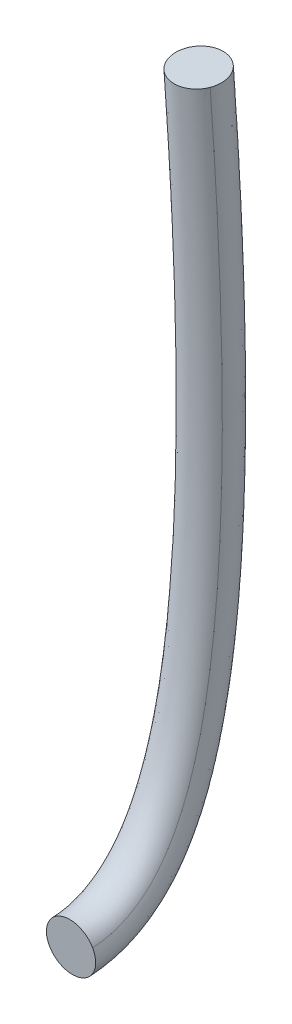
ISO-10303-21;
HEADER;
FILE_DESCRIPTION(('STEP AP214'),'2;1');
FILE_NAME('part.step','',(''),(''),'','','');
FILE_SCHEMA(('AUTOMOTIVE_DESIGN { 1 0 10303 214 1 1 1 1 }'));
ENDSEC;
DATA;
#1=APPLICATION_CONTEXT('core data for automotive mechanical design processes');
#2=APPLICATION_PROTOCOL_DEFINITION('international standard','automotive_design',2000,#1);
#3=PRODUCT_CONTEXT('',#1,'mechanical');
#4=PRODUCT('Part','Part','',(#3));
#5=PRODUCT_RELATED_PRODUCT_CATEGORY('part','',(#4));
#6=PRODUCT_DEFINITION_FORMATION('','',#4);
#7=PRODUCT_DEFINITION_CONTEXT('part definition',#1,'design');
#8=PRODUCT_DEFINITION('design','',#6,#7);
#9=PRODUCT_DEFINITION_SHAPE('','',#8);
#10=(LENGTH_UNIT() NAMED_UNIT(*) SI_UNIT(.MILLI.,.METRE.));
#11=(NAMED_UNIT(*) PLANE_ANGLE_UNIT() SI_UNIT($,.RADIAN.));
#12=(NAMED_UNIT(*) SI_UNIT($,.STERADIAN.) SOLID_ANGLE_UNIT());
#13=UNCERTAINTY_MEASURE_WITH_UNIT(LENGTH_MEASURE(1.E-05),#10,'distance_accuracy_value','');
#14=(GEOMETRIC_REPRESENTATION_CONTEXT(3) GLOBAL_UNCERTAINTY_ASSIGNED_CONTEXT((#13)) GLOBAL_UNIT_ASSIGNED_CONTEXT((#10,
#11,#12)) REPRESENTATION_CONTEXT('',''));
#15=CARTESIAN_POINT('',(0.,0.,0.));
#16=DIRECTION('',(0.,0.,1.));
#17=DIRECTION('',(1.,0.,0.));
#18=AXIS2_PLACEMENT_3D('',#15,#16,#17);
#19=CARTESIAN_POINT('',(17.9828948609528,-7.28816581524924,11.1726701010151));
#20=CARTESIAN_POINT('',(17.9828948609529,-7.27979984538482,11.0210211909464));
#21=CARTESIAN_POINT('',(17.9828948609531,-7.19251932348195,10.7546346271501));
#22=CARTESIAN_POINT('',(17.982894860953,-6.82521696261271,10.4241670798163));
#23=CARTESIAN_POINT('',(17.9828948609526,-6.16593331407854,10.1770697024865));
#24=CARTESIAN_POINT('',(17.9828948609521,-5.06042478911119,10.0061113265432));
#25=CARTESIAN_POINT('',(17.9828948609519,-3.38309790841542,9.96220340685519));
#26=CARTESIAN_POINT('',(17.9828948609523,-1.84086867718057,10.0365190113268));
#27=CARTESIAN_POINT('',(17.9828948609527,-1.0071145733577,10.0974125910793));
#28=CARTESIAN_POINT('',(17.9537952925283,-7.22780287596828,11.1760001251526));
#29=CARTESIAN_POINT('',(17.9537952925284,-7.21999009473669,11.0343787976106));
#30=CARTESIAN_POINT('',(17.9537952925286,-7.14065988628679,10.7916644286922));
#31=CARTESIAN_POINT('',(17.9537952925285,-6.79719097052566,10.4792288227987));
#32=CARTESIAN_POINT('',(17.9537952925281,-6.15275477480742,10.2363735809446));
#33=CARTESIAN_POINT('',(17.9537952925276,-5.05673173542727,10.0666883604314));
#34=CARTESIAN_POINT('',(17.9537952925274,-3.38440018237537,10.0226626634998));
#35=CARTESIAN_POINT('',(17.9537952925278,-1.84433188417572,10.0968818207855));
#36=CARTESIAN_POINT('',(17.9537952925282,-1.01151818014321,10.157706718046));
#37=CARTESIAN_POINT('',(17.8372931422432,-7.13476731687341,11.1811325898919));
#38=CARTESIAN_POINT('',(17.8372931422434,-7.12780674764234,11.0549592048029));
#39=CARTESIAN_POINT('',(17.8372931422436,-7.06073585925256,10.8487282128721));
#40=CARTESIAN_POINT('',(17.8372931422435,-6.75399018511548,10.5640769234541));
#41=CARTESIAN_POINT('',(17.8372931422431,-6.13243652817361,10.327766226239));
#42=CARTESIAN_POINT('',(17.8372931422426,-5.05103406644591,10.1600468345949));
#43=CARTESIAN_POINT('',(17.8372931422424,-3.3864021048026,10.1158428459373));
#44=CARTESIAN_POINT('',(17.8372931422428,-1.84967030091329,10.1899171300291));
#45=CARTESIAN_POINT('',(17.8372931422433,-1.01830532510668,10.2506362188175));
#46=CARTESIAN_POINT('',(17.6193944079575,-7.18477640782297,11.1783737533946));
#47=CARTESIAN_POINT('',(17.6193944079577,-7.17735849766137,11.0439102053286));
#48=CARTESIAN_POINT('',(17.6193944079579,-7.10368721033171,10.8180718793657));
#49=CARTESIAN_POINT('',(17.6193944079577,-6.77722139184719,10.5185002285866));
#50=CARTESIAN_POINT('',(17.6193944079574,-6.14337034316558,10.2786599971527));
#51=CARTESIAN_POINT('',(17.6193944079569,-5.05410727978171,10.1098773088842));
#52=CARTESIAN_POINT('',(17.6193944079566,-3.3853357544798,10.0657631380452));
#53=CARTESIAN_POINT('',(17.619394407957,-1.84679949203958,10.1399082659676));
#54=CARTESIAN_POINT('',(17.6193944079575,-1.01465705391788,10.2006841370415));
#55=CARTESIAN_POINT('',(17.5550000000014,-7.31847179552639,11.1709982201049));
#56=CARTESIAN_POINT('',(17.5550000000015,-7.30982729388697,11.0143003987002));
#57=CARTESIAN_POINT('',(17.5550000000017,-7.21856663037596,10.7360252213707));
#58=CARTESIAN_POINT('',(17.5550000000016,-6.83927747920377,10.396489078144));
#59=CARTESIAN_POINT('',(17.5550000000013,-6.1725367206153,10.1472743428811));
#60=CARTESIAN_POINT('',(17.5550000000008,-5.06226765115461,9.97568382362931));
#61=CARTESIAN_POINT('',(17.5550000000005,-3.38243368726151,9.93184146326353));
#62=CARTESIAN_POINT('',(17.5550000000009,-1.83913128396928,10.00621299735));
#63=CARTESIAN_POINT('',(17.5550000000014,-1.00490368664486,10.0671411588984));
#64=CARTESIAN_POINT('',(17.555,-7.38568943191456,11.1672900449514));
#65=CARTESIAN_POINT('',(17.5550000000002,-7.37642950308164,10.9994364502612));
#66=CARTESIAN_POINT('',(17.5550000000004,-7.27630738479391,10.6948035976056));
#67=CARTESIAN_POINT('',(17.5550000000003,-6.87049354697238,10.3351990877175));
#68=CARTESIAN_POINT('',(17.5549999999999,-6.18722129795571,10.0812514068247));
#69=CARTESIAN_POINT('',(17.5549999999994,-5.06638830404402,9.90823800900155));
#70=CARTESIAN_POINT('',(17.5549999999991,-3.38099110822586,9.86452211553343));
#71=CARTESIAN_POINT('',(17.5549999999996,-1.83527381521949,9.93899557759439));
#72=CARTESIAN_POINT('',(17.555,-1.00000001490137,10.0000001490162));
#73=B_SPLINE_SURFACE_WITH_KNOTS('',3,3,((#19,#20,#21,#22,#23,#24,#25,#26,#27),(#28,#29,#30,#31,
#32,#33,#34,#35,#36),(#37,#38,#39,#40,#41,#42,#43,#44,#45),(#46,#47,#48,#49,#50,#51,#52,#53,
#54),(#55,#56,#57,#58,#59,#60,#61,#62,#63),(#64,#65,#66,#67,#68,#69,#70,#71,#72)),.UNSPECIFIED.,
.F.,.F.,.F.,(4,1,1,4),(4,1,1,1,1,1,4),(0.448798950512828,1.34639685153848,2.24399475256414,
3.14159265358979),(0.,0.142857142857143,0.285714285714286,0.428571428571429,0.571428571428571,
0.785714285714286,1.),.UNSPECIFIED.);
#74=CARTESIAN_POINT('',(17.555,-7.38568943191456,11.1672900449514));
#75=CARTESIAN_POINT('',(17.5550000000002,-7.37642950308164,10.9994364502612));
#76=CARTESIAN_POINT('',(17.5550000000004,-7.27630738479391,10.6948035976056));
#77=CARTESIAN_POINT('',(17.5550000000003,-6.87049354697238,10.3351990877175));
#78=CARTESIAN_POINT('',(17.5549999999999,-6.18722129795571,10.0812514068247));
#79=CARTESIAN_POINT('',(17.5549999999994,-5.06638830404402,9.90823800900155));
#80=CARTESIAN_POINT('',(17.5549999999991,-3.38099110822586,9.86452211553343));
#81=CARTESIAN_POINT('',(17.5549999999996,-1.83527381521949,9.93899557759439));
#82=CARTESIAN_POINT('',(17.555,-1.00000001490137,10.0000001490162));
#83=B_SPLINE_CURVE_WITH_KNOTS('',3,(#74,#75,#76,#77,#78,#79,#80,#81,#82),.UNSPECIFIED.,.F.,.F.,
(4,1,1,1,1,1,4),(0.,0.142857142857143,0.285714285714286,0.428571428571429,0.571428571428571,
0.785714285714286,1.),.UNSPECIFIED.);
#84=CARTESIAN_POINT('',(17.555,-7.38568943191456,11.1672900449514));
#85=VERTEX_POINT('',#84);
#86=CARTESIAN_POINT('',(17.555,-1.00000001490137,10.0000001490162));
#87=VERTEX_POINT('',#86);
#88=EDGE_CURVE('E11',#85,#87,#83,.T.);
#89=CARTESIAN_POINT('',(17.555,-7.38568943191456,11.1672900449514));
#90=CARTESIAN_POINT('',(17.5549787274771,-7.41102471275125,11.1658923811245));
#91=CARTESIAN_POINT('',(17.5594742792876,-7.43643253137826,11.1644907156272));
#92=CARTESIAN_POINT('',(17.5764203979954,-7.48437601313137,11.1618458319721));
#93=CARTESIAN_POINT('',(17.5888657028604,-7.50691356429396,11.1606025096577));
#94=CARTESIAN_POINT('',(17.62068241915,-7.54639939321399,11.1584242067958));
#95=CARTESIAN_POINT('',(17.6400432100441,-7.56335616540561,11.1574887576383));
#96=CARTESIAN_POINT('',(17.6830889643929,-7.58996281842432,11.1560209564043));
#97=CARTESIAN_POINT('',(17.7067443116465,-7.59966054680912,11.1554859647358));
#98=CARTESIAN_POINT('',(17.7560076016807,-7.61052235072792,11.1548867548621));
#99=CARTESIAN_POINT('',(17.7816204807639,-7.61166408187141,11.1548237693232));
#100=CARTESIAN_POINT('',(17.8318892542795,-7.60564134921908,11.1551560236062));
#101=CARTESIAN_POINT('',(17.8565434788333,-7.59846300864074,11.1555520289644));
#102=CARTESIAN_POINT('',(17.9020065070542,-7.57620555302376,11.1567798993321));
#103=CARTESIAN_POINT('',(17.9228097887315,-7.5611152096526,11.1576123837715));
#104=CARTESIAN_POINT('',(17.9585076077076,-7.52495357970438,11.1596073015475));
#105=CARTESIAN_POINT('',(17.9733789898422,-7.5038593953419,11.1607709980792));
#106=CARTESIAN_POINT('',(17.9945562726862,-7.45822998378214,11.1632882221191));
#107=CARTESIAN_POINT('',(18.0010306892592,-7.43377371561458,11.1646373937181));
#108=CARTESIAN_POINT('',(18.0047933580637,-7.39652794522938,11.1666921199439));
#109=CARTESIAN_POINT('',(18.0050376426428,-7.38393459611462,11.1673868534513));
#110=CARTESIAN_POINT('',(18.0035025302005,-7.35885995780878,11.16877013849));
#111=CARTESIAN_POINT('',(18.0017241531995,-7.34637861533122,11.1694586929609));
#112=CARTESIAN_POINT('',(17.9960058832831,-7.32135945624951,11.1708389173938));
#113=CARTESIAN_POINT('',(17.9919782108732,-7.30884135038829,11.1715294999793));
#114=CARTESIAN_POINT('',(17.981666296378,-7.28477231923517,11.1728573089902));
#115=CARTESIAN_POINT('',(17.9753834815006,-7.27322078791776,11.1734945688482));
#116=CARTESIAN_POINT('',(17.9613882215489,-7.25221068569534,11.1746536268458));
#117=CARTESIAN_POINT('',(17.9538105464108,-7.24266144101503,11.1751804271583));
#118=CARTESIAN_POINT('',(17.9372451544926,-7.22485205074891,11.176162912441));
#119=CARTESIAN_POINT('',(17.9282555430136,-7.2165936675374,11.1766185001866));
#120=CARTESIAN_POINT('',(17.9085042664574,-7.20109346442636,11.1774735952352));
#121=CARTESIAN_POINT('',(17.8976669355207,-7.19394752816238,11.1778678129543));
#122=CARTESIAN_POINT('',(17.8749582710206,-7.1815732741487,11.1785504597081));
#123=CARTESIAN_POINT('',(17.8630884396757,-7.17634222626356,11.1788390393552));
#124=CARTESIAN_POINT('',(17.8386530200918,-7.16811186531233,11.1792930812053));
#125=CARTESIAN_POINT('',(17.826091117051,-7.16510176652687,11.1794591384208));
#126=CARTESIAN_POINT('',(17.8006273173911,-7.16139489732678,11.1796636341603));
#127=CARTESIAN_POINT('',(17.7877252116967,-7.16069958454094,11.1797019922718));
#128=CARTESIAN_POINT('',(17.7627092575344,-7.1614527433657,11.1796604429852));
#129=CARTESIAN_POINT('',(17.750591327366,-7.16278461841239,11.1795869678346));
#130=CARTESIAN_POINT('',(17.7267024472358,-7.16730519940402,11.179337582301));
#131=CARTESIAN_POINT('',(17.714931678428,-7.1704948573672,11.1791616193983));
#132=CARTESIAN_POINT('',(17.6911222318988,-7.17899075575905,11.178692928724));
#133=CARTESIAN_POINT('',(17.6791354553194,-7.18444389803625,11.1783920968622));
#134=CARTESIAN_POINT('',(17.6563290996798,-7.19736744633008,11.1776791473559));
#135=CARTESIAN_POINT('',(17.6455078855712,-7.20483497361077,11.1772671885217));
#136=CARTESIAN_POINT('',(17.616456190345,-7.22919786630976,11.175923168139));
#137=CARTESIAN_POINT('',(17.6002418441554,-7.24855625463276,11.1748552297459));
#138=CARTESIAN_POINT('',(17.5746441856777,-7.29145024800524,11.1724889096994));
#139=CARTESIAN_POINT('',(17.565304015267,-7.31501110069236,11.1711891352172));
#140=CARTESIAN_POINT('',(17.5567288082222,-7.35460631274689,11.1690047980487));
#141=CARTESIAN_POINT('',(17.5550130607995,-7.37013420021109,11.1681481757458));
#142=CARTESIAN_POINT('',(17.555,-7.38568943191456,11.1672900449514));
#143=B_SPLINE_CURVE_WITH_KNOTS('',3,(#89,#90,#91,#92,#93,#94,#95,#96,#97,#98,#99,#100,#101,#102,
#103,#104,#105,#106,#107,#108,#109,#110,#111,#112,#113,#114,#115,#116,#117,#118,#119,#120,#121,
#122,#123,#124,#125,#126,#127,#128,#129,#130,#131,#132,#133,#134,#135,#136,#137,#138,#139,#140,
#141,#142),.UNSPECIFIED.,.T.,.F.,(4,2,2,2,2,2,2,2,2,2,2,2,2,2,2,2,2,2,2,2,2,2,2,2,2,2,4),(0.,
0.0759486066991358,0.151846994167119,0.227629317542076,0.3029076178249,0.378382442656016,
0.453983330905396,0.529691799852834,0.605692970633179,0.680144014351651,0.717867994614963,
0.755572959255383,0.794864022626057,0.834130263649917,0.870581684838747,0.907082445377711,
0.945866090842247,0.984594223488994,1.02313301781127,1.06169607556072,1.09812339418812,
1.13456939638827,1.17388556286445,1.2131458379946,1.28747622307096,1.36226921307139,
1.40889976681879),.UNSPECIFIED.);
#144=CARTESIAN_POINT('',(17.9828948609528,-7.28816581524924,11.1726701010151));
#145=VERTEX_POINT('',#144);
#146=EDGE_CURVE('E45',#145,#85,#143,.T.);
#147=CARTESIAN_POINT('',(17.9828948609528,-7.28816581524924,11.1726701010151));
#148=CARTESIAN_POINT('',(17.9828948609529,-7.27979984538482,11.0210211909464));
#149=CARTESIAN_POINT('',(17.9828948609531,-7.19251932348195,10.7546346271501));
#150=CARTESIAN_POINT('',(17.982894860953,-6.82521696261271,10.4241670798163));
#151=CARTESIAN_POINT('',(17.9828948609526,-6.16593331407854,10.1770697024865));
#152=CARTESIAN_POINT('',(17.9828948609521,-5.06042478911119,10.0061113265432));
#153=CARTESIAN_POINT('',(17.9828948609519,-3.38309790841542,9.96220340685519));
#154=CARTESIAN_POINT('',(17.9828948609523,-1.84086867718057,10.0365190113268));
#155=CARTESIAN_POINT('',(17.9828948609527,-1.0071145733577,10.0974125910793));
#156=B_SPLINE_CURVE_WITH_KNOTS('',3,(#147,#148,#149,#150,#151,#152,#153,#154,#155),
.UNSPECIFIED.,.F.,.F.,(4,1,1,1,1,1,4),(0.,0.142857142857143,0.285714285714286,0.428571428571429,
0.571428571428571,0.785714285714286,1.),.UNSPECIFIED.);
#157=CARTESIAN_POINT('',(17.9828948609527,-1.0071145733577,10.0974125910793));
#158=VERTEX_POINT('',#157);
#159=EDGE_CURVE('E29',#145,#158,#156,.T.);
#160=CARTESIAN_POINT('',(17.555,-1.00000001490137,10.0000001490162));
#161=CARTESIAN_POINT('',(17.5550109258887,-1.00092580970206,10.0126761194143));
#162=CARTESIAN_POINT('',(17.556153025859,-1.00185188551025,10.0253559373633));
#163=CARTESIAN_POINT('',(17.5605838617681,-1.00367793175485,10.0503581388496));
#164=CARTESIAN_POINT('',(17.5638776976219,-1.00457783485198,10.0626796003785));
#165=CARTESIAN_POINT('',(17.5724215761546,-1.00632384922809,10.08658600656));
#166=CARTESIAN_POINT('',(17.5776659177798,-1.00717010894382,10.0981729836068));
#167=CARTESIAN_POINT('',(17.5899672644214,-1.00878880821922,10.1203361930814));
#168=CARTESIAN_POINT('',(17.5970229824559,-1.00956129965875,10.1309131358476));
#169=CARTESIAN_POINT('',(17.6130475330382,-1.01103195886521,10.1510493826191));
#170=CARTESIAN_POINT('',(17.6220672831449,-1.01172721185437,10.1605687775253));
#171=CARTESIAN_POINT('',(17.6417147706393,-1.01298383289045,10.1777744164453));
#172=CARTESIAN_POINT('',(17.6523414284897,-1.01354529017526,10.1854618823034));
#173=CARTESIAN_POINT('',(17.6740020608389,-1.01448716523158,10.1983580233527));
#174=CARTESIAN_POINT('',(17.6849560468646,-1.0148774723909,10.2037021039135));
#175=CARTESIAN_POINT('',(17.7075797325245,-1.01552888253597,10.2126212031671));
#176=CARTESIAN_POINT('',(17.7192503909068,-1.01578980801122,10.2161937913883));
#177=CARTESIAN_POINT('',(17.7437367343103,-1.01618882320902,10.2216571022989));
#178=CARTESIAN_POINT('',(17.7565787359315,-1.01631839245544,10.2234311627395));
#179=CARTESIAN_POINT('',(17.7823669991049,-1.01641929348824,10.2248126983711));
#180=CARTESIAN_POINT('',(17.7953130877931,-1.01639084849847,10.2244232299402));
#181=CARTESIAN_POINT('',(17.8208883822237,-1.01616582126333,10.2213421599564));
#182=CARTESIAN_POINT('',(17.8335185520129,-1.01596983795987,10.2186587591084));
#183=CARTESIAN_POINT('',(17.8580869140907,-1.01541487196054,10.2110601718465));
#184=CARTESIAN_POINT('',(17.8700246885338,-1.01505579197012,10.2061436532771));
#185=CARTESIAN_POINT('',(17.8922673547765,-1.01422128741594,10.1947176277495));
#186=CARTESIAN_POINT('',(17.9026259968799,-1.01375337428598,10.1883109672455));
#187=CARTESIAN_POINT('',(17.9222313573681,-1.01270636685299,10.1739753550587));
#188=CARTESIAN_POINT('',(17.931477438799,-1.01212720934921,10.166045538032));
#189=CARTESIAN_POINT('',(17.949312424714,-1.0108203944598,10.1481526455233));
#190=CARTESIAN_POINT('',(17.9577894691079,-1.01008456079276,10.1380776205021));
#191=CARTESIAN_POINT('',(17.9728211066353,-1.00851723873657,10.116617867246));
#192=CARTESIAN_POINT('',(17.9793785168292,-1.00768589303325,10.1052350926635));
#193=CARTESIAN_POINT('',(17.9951268221104,-1.00516538945402,10.0707243903624));
#194=CARTESIAN_POINT('',(18.0014235725758,-1.00337431205483,10.0462009818535));
#195=CARTESIAN_POINT('',(18.0048744485045,-1.00065795556197,10.0090086640004));
#196=CARTESIAN_POINT('',(18.0050135929016,-0.99974367883645,9.99649039893813));
#197=CARTESIAN_POINT('',(18.0032930383759,-0.997924210617665,9.97157826369575));
#198=CARTESIAN_POINT('',(18.0014346483117,-0.997019013567097,9.95918431742512));
#199=CARTESIAN_POINT('',(17.9955671605391,-0.995200063989509,9.93427928341132));
#200=CARTESIAN_POINT('',(17.9914591451676,-0.994287985000621,9.92179110973056));
#201=CARTESIAN_POINT('',(17.9810064873988,-0.992534323158184,9.89777999453931));
#202=CARTESIAN_POINT('',(17.9746621518833,-0.991692730651637,9.88625692086011));
#203=CARTESIAN_POINT('',(17.9605118913823,-0.990157308789329,9.86523394464496));
#204=CARTESIAN_POINT('',(17.9528285978137,-0.989457416868279,9.85565103354374));
#205=CARTESIAN_POINT('',(17.9360265426204,-0.988155671749476,9.83782755626851));
#206=CARTESIAN_POINT('',(17.9269072291485,-0.987553856423181,9.82958750863001));
#207=CARTESIAN_POINT('',(17.907039707438,-0.986440068511396,9.81433753899439));
#208=CARTESIAN_POINT('',(17.8962379650897,-0.985933131516255,9.80739656423499));
#209=CARTESIAN_POINT('',(17.8735897841357,-0.985064188738059,9.7954990109914));
#210=CARTESIAN_POINT('',(17.8617437274281,-0.984702130240073,9.79054171073507));
#211=CARTESIAN_POINT('',(17.8376323125895,-0.984135807464393,9.78278762663918));
#212=CARTESIAN_POINT('',(17.8253803751681,-0.983928484835537,9.77994896789518));
#213=CARTESIAN_POINT('',(17.8005742525679,-0.983661570210727,9.77629437631593));
#214=CARTESIAN_POINT('',(17.788019968838,-0.983602027060598,9.77547911227708));
#215=CARTESIAN_POINT('',(17.7626182732445,-0.983634269388105,9.77592057380711));
#216=CARTESIAN_POINT('',(17.7497716396555,-0.98372999195386,9.77723120593544));
#217=CARTESIAN_POINT('',(17.7245133511483,-0.9840848535487,9.78208996628754));
#218=CARTESIAN_POINT('',(17.7121015744107,-0.984343946419142,9.78563746250777));
#219=CARTESIAN_POINT('',(17.6884354825133,-0.985002490988233,9.79465424620273));
#220=CARTESIAN_POINT('',(17.6771575704743,-0.985397482202726,9.80006246078628));
#221=CARTESIAN_POINT('',(17.6556309092793,-0.986315656751378,9.81263409479245));
#222=CARTESIAN_POINT('',(17.6453823510939,-0.986838863811056,9.81979783906457));
#223=CARTESIAN_POINT('',(17.6259595965394,-0.988016645646907,9.83592401267841));
#224=CARTESIAN_POINT('',(17.6168195695772,-0.988674237227378,9.84492774806543));
#225=CARTESIAN_POINT('',(17.6002613544678,-0.990094366176443,9.86437213520871));
#226=CARTESIAN_POINT('',(17.5928430793332,-0.990856898240072,9.87481271432948));
#227=CARTESIAN_POINT('',(17.5737488902606,-0.993226390913928,9.90725577727381));
#228=CARTESIAN_POINT('',(17.56466578781,-0.994950891051668,9.93086761078286));
#229=CARTESIAN_POINT('',(17.5565627372199,-0.997806130586163,9.96996151344));
#230=CARTESIAN_POINT('',(17.5549870519646,-0.998902875418757,9.98497812945669));
#231=CARTESIAN_POINT('',(17.555,-1.00000001490137,10.0000001490162));
#232=B_SPLINE_CURVE_WITH_KNOTS('',3,(#160,#161,#162,#163,#164,#165,#166,#167,#168,#169,#170,
#171,#172,#173,#174,#175,#176,#177,#178,#179,#180,#181,#182,#183,#184,#185,#186,#187,#188,#189,
#190,#191,#192,#193,#194,#195,#196,#197,#198,#199,#200,#201,#202,#203,#204,#205,#206,#207,#208,
#209,#210,#211,#212,#213,#214,#215,#216,#217,#218,#219,#220,#221,#222,#223,#224,#225,#226,#227,
#228,#229,#230,#231),.UNSPECIFIED.,.T.,.F.,(4,2,2,2,2,2,2,2,2,2,2,2,2,2,2,2,2,2,2,2,2,2,2,2,2,2,
2,2,2,2,2,2,2,2,2,4),(0.,0.0380918255708393,0.0762742632660008,0.114345965073643,
0.152390691461817,0.191573550114243,0.23073020131476,0.267158188720046,0.303636017659139,
0.342352332765455,0.381013967954733,0.419537964786892,0.458084973167201,0.494505402028649,
0.530946583789762,0.570304953116594,0.609605271178396,0.684072743104415,0.721620326586792,
0.759143322491407,0.79846676445989,0.837784812317698,0.874533043301793,0.911295430857229,
0.949654046008332,0.987998691423081,1.02556378037021,1.06314128412303,1.10168662645717,
1.14022108306782,1.17759541961075,1.21497667726386,1.25331370849423,1.29164880241772,
1.36617745671819,1.41131925894817),.UNSPECIFIED.);
#233=EDGE_CURVE('E48',#87,#158,#232,.T.);
#234=ORIENTED_EDGE('',*,*,#88,.F.);
#235=ORIENTED_EDGE('',*,*,#146,.F.);
#236=ORIENTED_EDGE('',*,*,#159,.T.);
#237=ORIENTED_EDGE('',*,*,#233,.F.);
#238=EDGE_LOOP('',(#234,#235,#236,#237));
#239=FACE_BOUND('',#238,.T.);
#240=ADVANCED_FACE('F17',(#239),#73,.F.);
#241=CARTESIAN_POINT('',(17.78,-1.00000001490116,10.0000001490116));
#242=DIRECTION('',(-5.32623886368089E-13,-0.997343536648528,-0.0728414024124084));
#243=DIRECTION('',(0.,0.0728414024124084,-0.997343536648528));
#244=AXIS2_PLACEMENT_3D('',#241,#242,#243);
#245=PLANE('',#244);
#246=ORIENTED_EDGE('',*,*,#233,.T.);
#247=EDGE_CURVE('E80',#158,#87,#232,.T.);
#248=ORIENTED_EDGE('',*,*,#247,.T.);
#249=EDGE_LOOP('',(#246,#248));
#250=FACE_BOUND('',#249,.T.);
#251=ADVANCED_FACE('F72',(#250),#245,.F.);
#252=CARTESIAN_POINT('',(17.78,-7.38568943191911,11.1672900449514));
#253=DIRECTION('',(-1.11249196396045E-12,-0.0550829445172842,0.998481782118886));
#254=DIRECTION('',(0.,-0.998481782118886,-0.0550829445172842));
#255=AXIS2_PLACEMENT_3D('',#252,#253,#254);
#256=PLANE('',#255);
#257=EDGE_CURVE('E52',#85,#145,#143,.T.);
#258=ORIENTED_EDGE('',*,*,#257,.T.);
#259=ORIENTED_EDGE('',*,*,#146,.T.);
#260=EDGE_LOOP('',(#258,#259));
#261=FACE_BOUND('',#260,.T.);
#262=ADVANCED_FACE('F51',(#261),#256,.T.);
#263=CARTESIAN_POINT('',(17.555,-7.38568943191456,11.1672900449514));
#264=CARTESIAN_POINT('',(17.5550000000002,-7.37642950308164,10.9994364502612));
#265=CARTESIAN_POINT('',(17.5550000000004,-7.27630738479391,10.6948035976056));
#266=CARTESIAN_POINT('',(17.5550000000003,-6.87049354697238,10.3351990877175));
#267=CARTESIAN_POINT('',(17.5549999999999,-6.18722129795571,10.0812514068247));
#268=CARTESIAN_POINT('',(17.5549999999994,-5.06638830404402,9.90823800900155));
#269=CARTESIAN_POINT('',(17.5549999999991,-3.38099110822586,9.86452211553343));
#270=CARTESIAN_POINT('',(17.5549999999996,-1.83527381521949,9.93899557759439));
#271=CARTESIAN_POINT('',(17.555,-1.00000001490137,10.0000001490162));
#272=CARTESIAN_POINT('',(17.554999999999,-7.43610265920569,11.1645089135862));
#273=CARTESIAN_POINT('',(17.5549999999992,-7.42638032085317,10.9882732782254));
#274=CARTESIAN_POINT('',(17.5549999999994,-7.31962413810839,10.6638682837785));
#275=CARTESIAN_POINT('',(17.5549999999992,-6.89389475712469,10.2891962403215));
#276=CARTESIAN_POINT('',(17.5549999999989,-6.19822098452051,10.0317119787701));
#277=CARTESIAN_POINT('',(17.5549999999984,-5.0694669059248,9.85763886137456));
#278=CARTESIAN_POINT('',(17.5549999999981,-3.37989821810454,9.81402459070275));
#279=CARTESIAN_POINT('',(17.5549999999985,-1.83238214013708,9.88858240859414));
#280=CARTESIAN_POINT('',(17.554999999999,-0.996322261093757,9.94964439160444));
#281=CARTESIAN_POINT('',(17.5785391100475,-7.50310010667755,11.1608128855284));
#282=CARTESIAN_POINT('',(17.5785391100477,-7.49276364502284,10.9734451123601));
#283=CARTESIAN_POINT('',(17.5785391100479,-7.37718524159239,10.6227654868779));
#284=CARTESIAN_POINT('',(17.5785391100478,-6.92499936885807,10.2280770185193));
#285=CARTESIAN_POINT('',(17.5785391100474,-6.21284579313548,9.9658864565508));
#286=CARTESIAN_POINT('',(17.5785391100469,-5.0735639722797,9.79040143480988));
#287=CARTESIAN_POINT('',(17.5785391100466,-3.37845106722099,9.74691896417055));
#288=CARTESIAN_POINT('',(17.5785391100471,-1.82853851807828,9.82158508863255));
#289=CARTESIAN_POINT('',(17.5785391100475,-0.991434652607267,9.88272331962833));
#290=CARTESIAN_POINT('',(17.6505190833483,-7.57470774680984,11.1568625283572));
#291=CARTESIAN_POINT('',(17.6505190833485,-7.56371553905938,10.9576081261052));
#292=CARTESIAN_POINT('',(17.6505190833487,-7.43869873059526,10.5788488181541));
#293=CARTESIAN_POINT('',(17.6505190833486,-6.9582525501853,10.1627788869149));
#294=CARTESIAN_POINT('',(17.6505190833482,-6.22848737405222,9.89554822758815));
#295=CARTESIAN_POINT('',(17.6505190833477,-5.07795197296071,9.7185485083637));
#296=CARTESIAN_POINT('',(17.6505190833474,-3.37691263866721,9.67520177446663));
#297=CARTESIAN_POINT('',(17.6505190833479,-1.82442932968597,9.74997766374041));
#298=CARTESIAN_POINT('',(17.6505190833483,-0.986210720609659,9.81119731050171));
#299=CARTESIAN_POINT('',(17.7438355847652,-7.61993836278091,11.1543673045539));
#300=CARTESIAN_POINT('',(17.7438355847654,-7.60853107845988,10.9475888601949));
#301=CARTESIAN_POINT('',(17.7438355847656,-7.47756512784935,10.5510890938704));
#302=CARTESIAN_POINT('',(17.7438355847654,-6.97924541995067,10.1214966590491));
#303=CARTESIAN_POINT('',(17.7438355847651,-6.23835292294597,9.85109617979233));
#304=CARTESIAN_POINT('',(17.7438355847646,-5.08071119710778,9.67314749113105));
#305=CARTESIAN_POINT('',(17.7438355847643,-3.37592943759194,9.62989357908475));
#306=CARTESIAN_POINT('',(17.7438355847647,-1.82183527306593,9.70474707474506));
#307=CARTESIAN_POINT('',(17.7438355847652,-0.982911049490704,9.76601825635647));
#308=CARTESIAN_POINT('',(17.8850524391054,-7.60399735618256,11.1552467172762));
#309=CARTESIAN_POINT('',(17.8850524391056,-7.59273655491606,10.9511235532875));
#310=CARTESIAN_POINT('',(17.8850524391058,-7.46386452825342,10.5608771048295));
#311=CARTESIAN_POINT('',(17.8850524391056,-6.9718492341243,10.1360542810496));
#312=CARTESIAN_POINT('',(17.8850524391053,-6.23487910467969,9.86676793089808));
#313=CARTESIAN_POINT('',(17.8850524391048,-5.07974149068369,9.68915197447507));
#314=CARTESIAN_POINT('',(17.8850524391045,-3.37627848998266,9.64586378164126));
#315=CARTESIAN_POINT('',(17.8850524391049,-1.82274918826266,9.72068809593831));
#316=CARTESIAN_POINT('',(17.8850524391054,-0.984073980349695,9.78194109058665));
#317=CARTESIAN_POINT('',(18.0119035373636,-7.47839292780554,11.1621758990434));
#318=CARTESIAN_POINT('',(18.0119035373638,-7.46828329459383,10.9789198172507));
#319=CARTESIAN_POINT('',(18.011903537364,-7.35595326720523,10.6379313313682));
#320=CARTESIAN_POINT('',(18.0119035373639,-6.9135332397705,10.2506313244691));
#321=CARTESIAN_POINT('',(18.0119035373635,-6.20745827499399,9.99017081405779));
#322=CARTESIAN_POINT('',(18.011903537363,-5.07205807033013,9.81520333893958));
#323=CARTESIAN_POINT('',(18.0119035373627,-3.3789893577195,9.77166941158744));
#324=CARTESIAN_POINT('',(18.0119035373632,-1.82995536034777,9.84629226435053));
#325=CARTESIAN_POINT('',(18.0119035373636,-0.993237094665954,9.90740233290438));
#326=CARTESIAN_POINT('',(18.0119944293773,-7.3485287545302,11.1693400768776));
#327=CARTESIAN_POINT('',(18.0119944293774,-7.33960959603295,11.0076635842821));
#328=CARTESIAN_POINT('',(18.0119944293776,-7.24437876067712,10.717604825608));
#329=CARTESIAN_POINT('',(18.0119944293775,-6.85324295469975,10.3691053368339));
#330=CARTESIAN_POINT('',(18.0119944293771,-6.17911185334965,10.1177658240285));
#331=CARTESIAN_POINT('',(18.0119944293766,-5.06411784279511,9.94553429265505));
#332=CARTESIAN_POINT('',(18.0119944293764,-3.38179563445548,9.90174415021061));
#333=CARTESIAN_POINT('',(18.0119944293768,-1.83740547018542,9.976156201868));
#334=CARTESIAN_POINT('',(18.0119944293772,-1.00271096657219,10.0371184641126));
#335=CARTESIAN_POINT('',(17.9828948609528,-7.28816581524924,11.1726701010151));
#336=CARTESIAN_POINT('',(17.9828948609529,-7.27979984538482,11.0210211909464));
#337=CARTESIAN_POINT('',(17.9828948609531,-7.19251932348195,10.7546346271501));
#338=CARTESIAN_POINT('',(17.982894860953,-6.82521696261271,10.4241670798163));
#339=CARTESIAN_POINT('',(17.9828948609526,-6.16593331407854,10.1770697024865));
#340=CARTESIAN_POINT('',(17.9828948609521,-5.06042478911119,10.0061113265432));
#341=CARTESIAN_POINT('',(17.9828948609519,-3.38309790841542,9.96220340685519));
#342=CARTESIAN_POINT('',(17.9828948609523,-1.84086867718057,10.0365190113268));
#343=CARTESIAN_POINT('',(17.9828948609527,-1.0071145733577,10.0974125910793));
#344=B_SPLINE_SURFACE_WITH_KNOTS('',3,3,((#263,#264,#265,#266,#267,#268,#269,#270,#271),(#272,
#273,#274,#275,#276,#277,#278,#279,#280),(#281,#282,#283,#284,#285,#286,#287,#288,#289),(#290,
#291,#292,#293,#294,#295,#296,#297,#298),(#299,#300,#301,#302,#303,#304,#305,#306,#307),(#308,
#309,#310,#311,#312,#313,#314,#315,#316),(#317,#318,#319,#320,#321,#322,#323,#324,#325),(#326,
#327,#328,#329,#330,#331,#332,#333,#334),(#335,#336,#337,#338,#339,#340,#341,#342,#343)),
.UNSPECIFIED.,.F.,.F.,.F.,(4,1,1,1,1,1,4),(4,1,1,1,1,1,4),(-3.14159265358979,-2.46839422782055,
-2.24399475256414,-1.79519580205131,-1.12199737628207,-0.448798950512828,0.448798950512828),(0.,
0.142857142857143,0.285714285714286,0.428571428571429,0.571428571428571,0.785714285714286,1.),.UNSPECIFIED.);
#345=ORIENTED_EDGE('',*,*,#257,.F.);
#346=ORIENTED_EDGE('',*,*,#88,.T.);
#347=ORIENTED_EDGE('',*,*,#247,.F.);
#348=ORIENTED_EDGE('',*,*,#159,.F.);
#349=EDGE_LOOP('',(#345,#346,#347,#348));
#350=FACE_BOUND('',#349,.T.);
#351=ADVANCED_FACE('F54',(#350),#344,.F.);
#352=CLOSED_SHELL('',(#240,#251,#262,#351));
#353=MANIFOLD_SOLID_BREP('B1',#352);
#354=ADVANCED_BREP_SHAPE_REPRESENTATION('',(#18,#353),#14);
#355=SHAPE_DEFINITION_REPRESENTATION(#9,#354);
ENDSEC;
END-ISO-10303-21;
